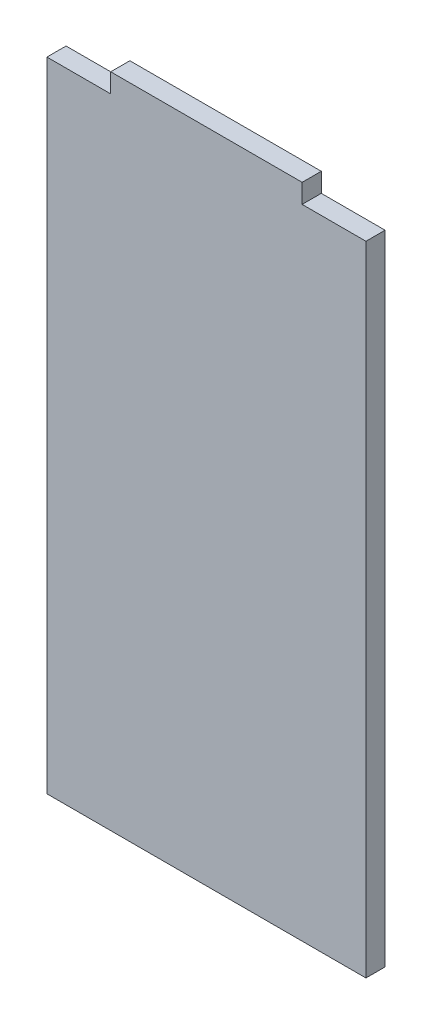
ISO-10303-21;
HEADER;
FILE_DESCRIPTION(('STEP AP214'),'2;1');
FILE_NAME('part.step','',(''),(''),'','','');
FILE_SCHEMA(('AUTOMOTIVE_DESIGN { 1 0 10303 214 1 1 1 1 }'));
ENDSEC;
DATA;
#1=APPLICATION_CONTEXT('core data for automotive mechanical design processes');
#2=APPLICATION_PROTOCOL_DEFINITION('international standard','automotive_design',2000,#1);
#3=PRODUCT_CONTEXT('',#1,'mechanical');
#4=PRODUCT('Part','Part','',(#3));
#5=PRODUCT_RELATED_PRODUCT_CATEGORY('part','',(#4));
#6=PRODUCT_DEFINITION_FORMATION('','',#4);
#7=PRODUCT_DEFINITION_CONTEXT('part definition',#1,'design');
#8=PRODUCT_DEFINITION('design','',#6,#7);
#9=PRODUCT_DEFINITION_SHAPE('','',#8);
#10=(LENGTH_UNIT() NAMED_UNIT(*) SI_UNIT(.MILLI.,.METRE.));
#11=(NAMED_UNIT(*) PLANE_ANGLE_UNIT() SI_UNIT($,.RADIAN.));
#12=(NAMED_UNIT(*) SI_UNIT($,.STERADIAN.) SOLID_ANGLE_UNIT());
#13=UNCERTAINTY_MEASURE_WITH_UNIT(LENGTH_MEASURE(1.E-05),#10,'distance_accuracy_value','');
#14=(GEOMETRIC_REPRESENTATION_CONTEXT(3) GLOBAL_UNCERTAINTY_ASSIGNED_CONTEXT((#13)) GLOBAL_UNIT_ASSIGNED_CONTEXT((#10,
#11,#12)) REPRESENTATION_CONTEXT('',''));
#15=CARTESIAN_POINT('',(0.,0.,0.));
#16=DIRECTION('',(0.,0.,1.));
#17=DIRECTION('',(1.,0.,0.));
#18=AXIS2_PLACEMENT_3D('',#15,#16,#17);
#19=CARTESIAN_POINT('',(0.,50.,3.));
#20=DIRECTION('',(0.,1.,0.));
#21=DIRECTION('',(0.,0.,1.));
#22=AXIS2_PLACEMENT_3D('',#19,#20,#21);
#23=PLANE('',#22);
#24=DIRECTION('',(1.,0.,0.));
#25=VECTOR('',#24,1.);
#26=CARTESIAN_POINT('',(0.,50.,0.));
#27=LINE('',#26,#25);
#28=CARTESIAN_POINT('',(15.,50.,0.));
#29=VERTEX_POINT('',#28);
#30=CARTESIAN_POINT('',(25.,50.,0.));
#31=VERTEX_POINT('',#30);
#32=EDGE_CURVE('E135',#29,#31,#27,.T.);
#33=ORIENTED_EDGE('',*,*,#32,.F.);
#34=DIRECTION('',(0.,0.,-1.));
#35=VECTOR('',#34,1.);
#36=CARTESIAN_POINT('',(15.,50.,3.));
#37=LINE('',#36,#35);
#38=CARTESIAN_POINT('',(15.,50.,3.));
#39=VERTEX_POINT('',#38);
#40=EDGE_CURVE('E11',#39,#29,#37,.T.);
#41=ORIENTED_EDGE('',*,*,#40,.F.);
#42=DIRECTION('',(1.,0.,0.));
#43=VECTOR('',#42,1.);
#44=CARTESIAN_POINT('',(0.,50.,3.));
#45=LINE('',#44,#43);
#46=CARTESIAN_POINT('',(25.,50.,3.));
#47=VERTEX_POINT('',#46);
#48=EDGE_CURVE('E130',#39,#47,#45,.T.);
#49=ORIENTED_EDGE('',*,*,#48,.T.);
#50=DIRECTION('',(0.,0.,-1.));
#51=VECTOR('',#50,1.);
#52=CARTESIAN_POINT('',(25.,50.,3.));
#53=LINE('',#52,#51);
#54=EDGE_CURVE('E88',#47,#31,#53,.T.);
#55=ORIENTED_EDGE('',*,*,#54,.T.);
#56=EDGE_LOOP('',(#33,#41,#49,#55));
#57=FACE_BOUND('',#56,.T.);
#58=ADVANCED_FACE('F37',(#57),#23,.T.);
#59=CARTESIAN_POINT('',(15.,0.,3.));
#60=DIRECTION('',(-1.,0.,0.));
#61=DIRECTION('',(0.,0.,1.));
#62=AXIS2_PLACEMENT_3D('',#59,#60,#61);
#63=PLANE('',#62);
#64=DIRECTION('',(0.,1.,0.));
#65=VECTOR('',#64,1.);
#66=CARTESIAN_POINT('',(15.,0.,0.));
#67=LINE('',#66,#65);
#68=CARTESIAN_POINT('',(15.,53.,0.));
#69=VERTEX_POINT('',#68);
#70=EDGE_CURVE('E138',#29,#69,#67,.T.);
#71=ORIENTED_EDGE('',*,*,#70,.T.);
#72=DIRECTION('',(0.,0.,-1.));
#73=VECTOR('',#72,1.);
#74=CARTESIAN_POINT('',(15.,53.,3.));
#75=LINE('',#74,#73);
#76=CARTESIAN_POINT('',(15.,53.,3.));
#77=VERTEX_POINT('',#76);
#78=EDGE_CURVE('E46',#77,#69,#75,.T.);
#79=ORIENTED_EDGE('',*,*,#78,.F.);
#80=DIRECTION('',(0.,1.,0.));
#81=VECTOR('',#80,1.);
#82=CARTESIAN_POINT('',(15.,0.,3.));
#83=LINE('',#82,#81);
#84=EDGE_CURVE('E175',#39,#77,#83,.T.);
#85=ORIENTED_EDGE('',*,*,#84,.F.);
#86=ORIENTED_EDGE('',*,*,#40,.T.);
#87=EDGE_LOOP('',(#71,#79,#85,#86));
#88=FACE_BOUND('',#87,.T.);
#89=ADVANCED_FACE('F39',(#88),#63,.F.);
#90=CARTESIAN_POINT('',(0.,53.,3.));
#91=DIRECTION('',(0.,1.,0.));
#92=DIRECTION('',(0.,0.,1.));
#93=AXIS2_PLACEMENT_3D('',#90,#91,#92);
#94=PLANE('',#93);
#95=DIRECTION('',(1.,0.,0.));
#96=VECTOR('',#95,1.);
#97=CARTESIAN_POINT('',(0.,53.,0.));
#98=LINE('',#97,#96);
#99=CARTESIAN_POINT('',(-15.,53.,0.));
#100=VERTEX_POINT('',#99);
#101=EDGE_CURVE('E142',#100,#69,#98,.T.);
#102=ORIENTED_EDGE('',*,*,#101,.F.);
#103=DIRECTION('',(0.,0.,-1.));
#104=VECTOR('',#103,1.);
#105=CARTESIAN_POINT('',(-15.,53.,3.));
#106=LINE('',#105,#104);
#107=CARTESIAN_POINT('',(-15.,53.,3.));
#108=VERTEX_POINT('',#107);
#109=EDGE_CURVE('E157',#108,#100,#106,.T.);
#110=ORIENTED_EDGE('',*,*,#109,.F.);
#111=DIRECTION('',(1.,0.,0.));
#112=VECTOR('',#111,1.);
#113=CARTESIAN_POINT('',(0.,53.,3.));
#114=LINE('',#113,#112);
#115=EDGE_CURVE('E164',#108,#77,#114,.T.);
#116=ORIENTED_EDGE('',*,*,#115,.T.);
#117=ORIENTED_EDGE('',*,*,#78,.T.);
#118=EDGE_LOOP('',(#102,#110,#116,#117));
#119=FACE_BOUND('',#118,.T.);
#120=ADVANCED_FACE('F162',(#119),#94,.T.);
#121=CARTESIAN_POINT('',(-15.,0.,3.));
#122=DIRECTION('',(-1.,0.,0.));
#123=DIRECTION('',(0.,0.,1.));
#124=AXIS2_PLACEMENT_3D('',#121,#122,#123);
#125=PLANE('',#124);
#126=DIRECTION('',(0.,1.,0.));
#127=VECTOR('',#126,1.);
#128=CARTESIAN_POINT('',(-15.,0.,0.));
#129=LINE('',#128,#127);
#130=CARTESIAN_POINT('',(-15.,50.,0.));
#131=VERTEX_POINT('',#130);
#132=EDGE_CURVE('E145',#131,#100,#129,.T.);
#133=ORIENTED_EDGE('',*,*,#132,.F.);
#134=DIRECTION('',(0.,0.,-1.));
#135=VECTOR('',#134,1.);
#136=CARTESIAN_POINT('',(-15.,50.,3.));
#137=LINE('',#136,#135);
#138=CARTESIAN_POINT('',(-15.,50.,3.));
#139=VERTEX_POINT('',#138);
#140=EDGE_CURVE('E155',#139,#131,#137,.T.);
#141=ORIENTED_EDGE('',*,*,#140,.F.);
#142=DIRECTION('',(0.,1.,0.));
#143=VECTOR('',#142,1.);
#144=CARTESIAN_POINT('',(-15.,0.,3.));
#145=LINE('',#144,#143);
#146=EDGE_CURVE('E128',#139,#108,#145,.T.);
#147=ORIENTED_EDGE('',*,*,#146,.T.);
#148=ORIENTED_EDGE('',*,*,#109,.T.);
#149=EDGE_LOOP('',(#133,#141,#147,#148));
#150=FACE_BOUND('',#149,.T.);
#151=ADVANCED_FACE('F173',(#150),#125,.T.);
#152=CARTESIAN_POINT('',(-25.,50.,0.));
#153=VERTEX_POINT('',#152);
#154=EDGE_CURVE('E139',#153,#131,#27,.T.);
#155=ORIENTED_EDGE('',*,*,#154,.F.);
#156=DIRECTION('',(0.,0.,-1.));
#157=VECTOR('',#156,1.);
#158=CARTESIAN_POINT('',(-25.,50.,3.));
#159=LINE('',#158,#157);
#160=CARTESIAN_POINT('',(-25.,50.,3.));
#161=VERTEX_POINT('',#160);
#162=EDGE_CURVE('E116',#161,#153,#159,.T.);
#163=ORIENTED_EDGE('',*,*,#162,.F.);
#164=EDGE_CURVE('E126',#161,#139,#45,.T.);
#165=ORIENTED_EDGE('',*,*,#164,.T.);
#166=ORIENTED_EDGE('',*,*,#140,.T.);
#167=EDGE_LOOP('',(#155,#163,#165,#166));
#168=FACE_BOUND('',#167,.T.);
#169=ADVANCED_FACE('F179',(#168),#23,.T.);
#170=CARTESIAN_POINT('',(-25.,0.,3.));
#171=DIRECTION('',(-1.,0.,0.));
#172=DIRECTION('',(0.,-1.,0.));
#173=AXIS2_PLACEMENT_3D('',#170,#171,#172);
#174=PLANE('',#173);
#175=DIRECTION('',(0.,1.,0.));
#176=VECTOR('',#175,1.);
#177=CARTESIAN_POINT('',(-25.,0.,0.));
#178=LINE('',#177,#176);
#179=CARTESIAN_POINT('',(-25.,-50.,0.));
#180=VERTEX_POINT('',#179);
#181=EDGE_CURVE('E115',#180,#153,#178,.T.);
#182=ORIENTED_EDGE('',*,*,#181,.F.);
#183=DIRECTION('',(0.,0.,-1.));
#184=VECTOR('',#183,1.);
#185=CARTESIAN_POINT('',(-25.,-50.,3.));
#186=LINE('',#185,#184);
#187=CARTESIAN_POINT('',(-25.,-50.,3.));
#188=VERTEX_POINT('',#187);
#189=EDGE_CURVE('E109',#188,#180,#186,.T.);
#190=ORIENTED_EDGE('',*,*,#189,.F.);
#191=DIRECTION('',(0.,1.,0.));
#192=VECTOR('',#191,1.);
#193=CARTESIAN_POINT('',(-25.,0.,3.));
#194=LINE('',#193,#192);
#195=EDGE_CURVE('E113',#188,#161,#194,.T.);
#196=ORIENTED_EDGE('',*,*,#195,.T.);
#197=ORIENTED_EDGE('',*,*,#162,.T.);
#198=EDGE_LOOP('',(#182,#190,#196,#197));
#199=FACE_BOUND('',#198,.T.);
#200=ADVANCED_FACE('F111',(#199),#174,.T.);
#201=CARTESIAN_POINT('',(0.,-50.,3.));
#202=DIRECTION('',(0.,1.,0.));
#203=DIRECTION('',(0.,0.,1.));
#204=AXIS2_PLACEMENT_3D('',#201,#202,#203);
#205=PLANE('',#204);
#206=DIRECTION('',(1.,0.,0.));
#207=VECTOR('',#206,1.);
#208=CARTESIAN_POINT('',(0.,-50.,0.));
#209=LINE('',#208,#207);
#210=CARTESIAN_POINT('',(25.,-50.,0.));
#211=VERTEX_POINT('',#210);
#212=EDGE_CURVE('E81',#180,#211,#209,.T.);
#213=ORIENTED_EDGE('',*,*,#212,.T.);
#214=DIRECTION('',(0.,0.,-1.));
#215=VECTOR('',#214,1.);
#216=CARTESIAN_POINT('',(25.,-50.,3.));
#217=LINE('',#216,#215);
#218=CARTESIAN_POINT('',(25.,-50.,3.));
#219=VERTEX_POINT('',#218);
#220=EDGE_CURVE('E117',#219,#211,#217,.T.);
#221=ORIENTED_EDGE('',*,*,#220,.F.);
#222=DIRECTION('',(1.,0.,0.));
#223=VECTOR('',#222,1.);
#224=CARTESIAN_POINT('',(0.,-50.,3.));
#225=LINE('',#224,#223);
#226=EDGE_CURVE('E119',#188,#219,#225,.T.);
#227=ORIENTED_EDGE('',*,*,#226,.F.);
#228=ORIENTED_EDGE('',*,*,#189,.T.);
#229=EDGE_LOOP('',(#213,#221,#227,#228));
#230=FACE_BOUND('',#229,.T.);
#231=ADVANCED_FACE('F120',(#230),#205,.F.);
#232=CARTESIAN_POINT('',(25.,0.,3.));
#233=DIRECTION('',(-1.,0.,0.));
#234=DIRECTION('',(0.,-1.,0.));
#235=AXIS2_PLACEMENT_3D('',#232,#233,#234);
#236=PLANE('',#235);
#237=DIRECTION('',(0.,1.,0.));
#238=VECTOR('',#237,1.);
#239=CARTESIAN_POINT('',(25.,0.,0.));
#240=LINE('',#239,#238);
#241=EDGE_CURVE('E150',#211,#31,#240,.T.);
#242=ORIENTED_EDGE('',*,*,#241,.T.);
#243=ORIENTED_EDGE('',*,*,#54,.F.);
#244=DIRECTION('',(0.,1.,0.));
#245=VECTOR('',#244,1.);
#246=CARTESIAN_POINT('',(25.,0.,3.));
#247=LINE('',#246,#245);
#248=EDGE_CURVE('E54',#219,#47,#247,.T.);
#249=ORIENTED_EDGE('',*,*,#248,.F.);
#250=ORIENTED_EDGE('',*,*,#220,.T.);
#251=EDGE_LOOP('',(#242,#243,#249,#250));
#252=FACE_BOUND('',#251,.T.);
#253=ADVANCED_FACE('F193',(#252),#236,.F.);
#254=CARTESIAN_POINT('',(0.,0.,3.));
#255=DIRECTION('',(0.,0.,1.));
#256=DIRECTION('',(1.,0.,0.));
#257=AXIS2_PLACEMENT_3D('',#254,#255,#256);
#258=PLANE('',#257);
#259=ORIENTED_EDGE('',*,*,#48,.F.);
#260=ORIENTED_EDGE('',*,*,#84,.T.);
#261=ORIENTED_EDGE('',*,*,#115,.F.);
#262=ORIENTED_EDGE('',*,*,#146,.F.);
#263=ORIENTED_EDGE('',*,*,#164,.F.);
#264=ORIENTED_EDGE('',*,*,#195,.F.);
#265=ORIENTED_EDGE('',*,*,#226,.T.);
#266=ORIENTED_EDGE('',*,*,#248,.T.);
#267=EDGE_LOOP('',(#259,#260,#261,#262,#263,#264,#265,#266));
#268=FACE_BOUND('',#267,.T.);
#269=ADVANCED_FACE('F123',(#268),#258,.T.);
#270=CARTESIAN_POINT('',(0.,0.,0.));
#271=DIRECTION('',(0.,0.,1.));
#272=DIRECTION('',(1.,0.,0.));
#273=AXIS2_PLACEMENT_3D('',#270,#271,#272);
#274=PLANE('',#273);
#275=ORIENTED_EDGE('',*,*,#32,.T.);
#276=ORIENTED_EDGE('',*,*,#241,.F.);
#277=ORIENTED_EDGE('',*,*,#212,.F.);
#278=ORIENTED_EDGE('',*,*,#181,.T.);
#279=ORIENTED_EDGE('',*,*,#154,.T.);
#280=ORIENTED_EDGE('',*,*,#132,.T.);
#281=ORIENTED_EDGE('',*,*,#101,.T.);
#282=ORIENTED_EDGE('',*,*,#70,.F.);
#283=EDGE_LOOP('',(#275,#276,#277,#278,#279,#280,#281,#282));
#284=FACE_BOUND('',#283,.T.);
#285=ADVANCED_FACE('F168',(#284),#274,.F.);
#286=CLOSED_SHELL('',(#58,#89,#120,#151,#169,#200,#231,#253,#269,#285));
#287=MANIFOLD_SOLID_BREP('B2',#286);
#288=ADVANCED_BREP_SHAPE_REPRESENTATION('',(#18,#287),#14);
#289=SHAPE_DEFINITION_REPRESENTATION(#9,#288);
ENDSEC;
END-ISO-10303-21;
